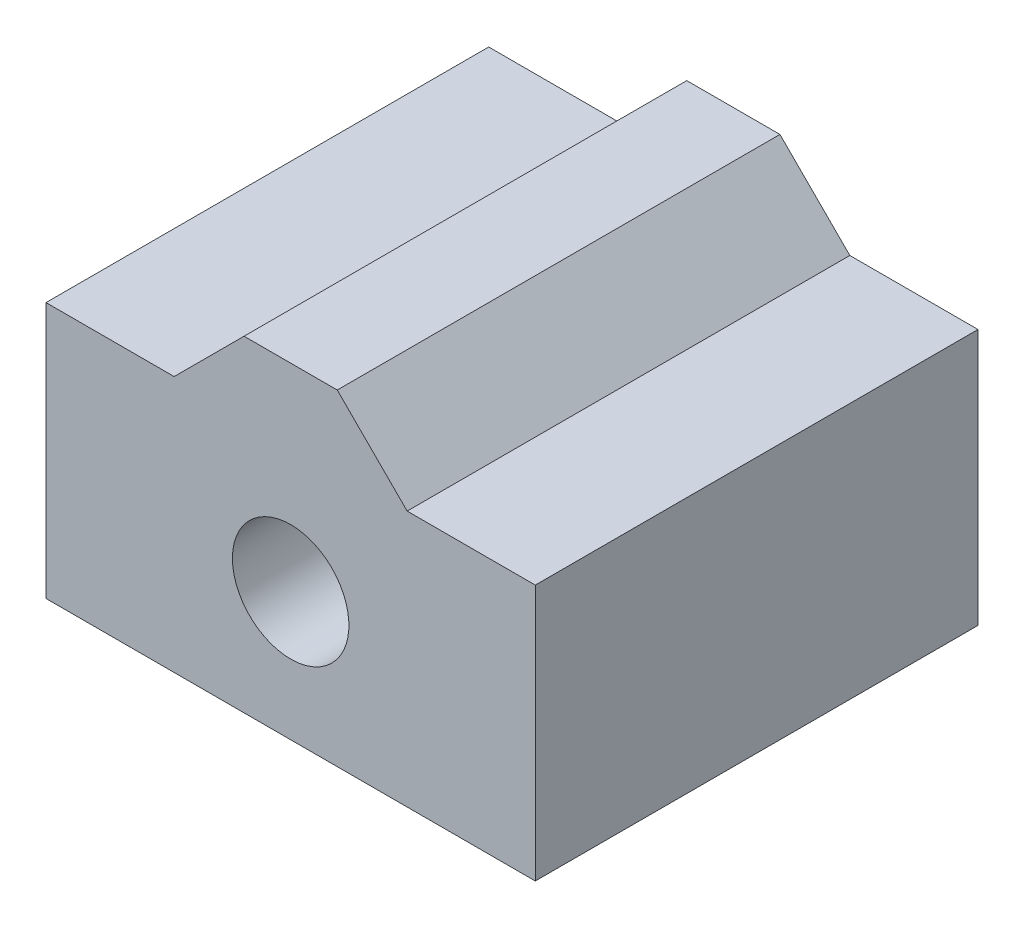
ISO-10303-21;
HEADER;
FILE_DESCRIPTION(('STEP AP214'),'2;1');
FILE_NAME('part.step','',(''),(''),'','','');
FILE_SCHEMA(('AUTOMOTIVE_DESIGN { 1 0 10303 214 1 1 1 1 }'));
ENDSEC;
DATA;
#1=APPLICATION_CONTEXT('core data for automotive mechanical design processes');
#2=APPLICATION_PROTOCOL_DEFINITION('international standard','automotive_design',2000,#1);
#3=PRODUCT_CONTEXT('',#1,'mechanical');
#4=PRODUCT('Part','Part','',(#3));
#5=PRODUCT_RELATED_PRODUCT_CATEGORY('part','',(#4));
#6=PRODUCT_DEFINITION_FORMATION('','',#4);
#7=PRODUCT_DEFINITION_CONTEXT('part definition',#1,'design');
#8=PRODUCT_DEFINITION('design','',#6,#7);
#9=PRODUCT_DEFINITION_SHAPE('','',#8);
#10=(LENGTH_UNIT() NAMED_UNIT(*) SI_UNIT(.MILLI.,.METRE.));
#11=(NAMED_UNIT(*) PLANE_ANGLE_UNIT() SI_UNIT($,.RADIAN.));
#12=(NAMED_UNIT(*) SI_UNIT($,.STERADIAN.) SOLID_ANGLE_UNIT());
#13=UNCERTAINTY_MEASURE_WITH_UNIT(LENGTH_MEASURE(1.E-05),#10,'distance_accuracy_value','');
#14=(GEOMETRIC_REPRESENTATION_CONTEXT(3) GLOBAL_UNCERTAINTY_ASSIGNED_CONTEXT((#13)) GLOBAL_UNIT_ASSIGNED_CONTEXT((#10,
#11,#12)) REPRESENTATION_CONTEXT('',''));
#15=CARTESIAN_POINT('',(0.,0.,0.));
#16=DIRECTION('',(0.,0.,1.));
#17=DIRECTION('',(1.,0.,0.));
#18=AXIS2_PLACEMENT_3D('',#15,#16,#17);
#19=CARTESIAN_POINT('',(8.334375,8.33437499999998,30.1625));
#20=DIRECTION('',(0.707106781186549,0.707106781186547,0.));
#21=DIRECTION('',(-0.707106781186547,0.707106781186549,0.));
#22=AXIS2_PLACEMENT_3D('',#19,#20,#21);
#23=PLANE('',#22);
#24=DIRECTION('',(0.707106781186546,-0.707106781186549,0.));
#25=VECTOR('',#24,1.);
#26=CARTESIAN_POINT('',(8.334375,8.33437499999998,0.));
#27=LINE('',#26,#25);
#28=CARTESIAN_POINT('',(3.175,13.49375,0.));
#29=VERTEX_POINT('',#28);
#30=CARTESIAN_POINT('',(7.93749999999998,8.73125,0.));
#31=VERTEX_POINT('',#30);
#32=EDGE_CURVE('E133',#29,#31,#27,.T.);
#33=ORIENTED_EDGE('',*,*,#32,.F.);
#34=DIRECTION('',(0.,0.,-1.));
#35=VECTOR('',#34,1.);
#36=CARTESIAN_POINT('',(3.175,13.49375,30.1625));
#37=LINE('',#36,#35);
#38=CARTESIAN_POINT('',(3.175,13.49375,30.1625));
#39=VERTEX_POINT('',#38);
#40=EDGE_CURVE('E11',#39,#29,#37,.T.);
#41=ORIENTED_EDGE('',*,*,#40,.F.);
#42=DIRECTION('',(0.707106781186546,-0.707106781186549,0.));
#43=VECTOR('',#42,1.);
#44=CARTESIAN_POINT('',(8.334375,8.33437499999998,30.1625));
#45=LINE('',#44,#43);
#46=CARTESIAN_POINT('',(7.93749999999998,8.73125,30.1625));
#47=VERTEX_POINT('',#46);
#48=EDGE_CURVE('E154',#39,#47,#45,.T.);
#49=ORIENTED_EDGE('',*,*,#48,.T.);
#50=DIRECTION('',(0.,0.,-1.));
#51=VECTOR('',#50,1.);
#52=CARTESIAN_POINT('',(7.93749999999998,8.73125,30.1625));
#53=LINE('',#52,#51);
#54=EDGE_CURVE('E51',#47,#31,#53,.T.);
#55=ORIENTED_EDGE('',*,*,#54,.T.);
#56=EDGE_LOOP('',(#33,#41,#49,#55));
#57=FACE_BOUND('',#56,.T.);
#58=ADVANCED_FACE('F35',(#57),#23,.T.);
#59=CARTESIAN_POINT('',(0.,13.49375,30.1625));
#60=DIRECTION('',(0.,1.,0.));
#61=DIRECTION('',(0.,0.,1.));
#62=AXIS2_PLACEMENT_3D('',#59,#60,#61);
#63=PLANE('',#62);
#64=DIRECTION('',(1.,0.,0.));
#65=VECTOR('',#64,1.);
#66=CARTESIAN_POINT('',(0.,13.49375,0.));
#67=LINE('',#66,#65);
#68=CARTESIAN_POINT('',(-3.175,13.49375,0.));
#69=VERTEX_POINT('',#68);
#70=EDGE_CURVE('E135',#69,#29,#67,.T.);
#71=ORIENTED_EDGE('',*,*,#70,.F.);
#72=DIRECTION('',(0.,0.,-1.));
#73=VECTOR('',#72,1.);
#74=CARTESIAN_POINT('',(-3.175,13.49375,30.1625));
#75=LINE('',#74,#73);
#76=CARTESIAN_POINT('',(-3.175,13.49375,30.1625));
#77=VERTEX_POINT('',#76);
#78=EDGE_CURVE('E43',#77,#69,#75,.T.);
#79=ORIENTED_EDGE('',*,*,#78,.F.);
#80=DIRECTION('',(1.,0.,0.));
#81=VECTOR('',#80,1.);
#82=CARTESIAN_POINT('',(0.,13.49375,30.1625));
#83=LINE('',#82,#81);
#84=EDGE_CURVE('E176',#77,#39,#83,.T.);
#85=ORIENTED_EDGE('',*,*,#84,.T.);
#86=ORIENTED_EDGE('',*,*,#40,.T.);
#87=EDGE_LOOP('',(#71,#79,#85,#86));
#88=FACE_BOUND('',#87,.T.);
#89=ADVANCED_FACE('F175',(#88),#63,.T.);
#90=CARTESIAN_POINT('',(-8.33437499999999,8.33437500000002,30.1625));
#91=DIRECTION('',(0.707106781186546,-0.707106781186549,0.));
#92=DIRECTION('',(0.707106781186549,0.707106781186546,0.));
#93=AXIS2_PLACEMENT_3D('',#90,#91,#92);
#94=PLANE('',#93);
#95=DIRECTION('',(-0.707106781186549,-0.707106781186546,0.));
#96=VECTOR('',#95,1.);
#97=CARTESIAN_POINT('',(-8.33437499999999,8.33437500000002,0.));
#98=LINE('',#97,#96);
#99=CARTESIAN_POINT('',(-7.93750000000001,8.73125,0.));
#100=VERTEX_POINT('',#99);
#101=EDGE_CURVE('E138',#69,#100,#98,.T.);
#102=ORIENTED_EDGE('',*,*,#101,.T.);
#103=DIRECTION('',(0.,0.,-1.));
#104=VECTOR('',#103,1.);
#105=CARTESIAN_POINT('',(-7.93750000000001,8.73125,30.1625));
#106=LINE('',#105,#104);
#107=CARTESIAN_POINT('',(-7.93750000000001,8.73125,30.1625));
#108=VERTEX_POINT('',#107);
#109=EDGE_CURVE('E160',#108,#100,#106,.T.);
#110=ORIENTED_EDGE('',*,*,#109,.F.);
#111=DIRECTION('',(-0.707106781186549,-0.707106781186546,0.));
#112=VECTOR('',#111,1.);
#113=CARTESIAN_POINT('',(-8.33437499999999,8.33437500000002,30.1625));
#114=LINE('',#113,#112);
#115=EDGE_CURVE('E166',#77,#108,#114,.T.);
#116=ORIENTED_EDGE('',*,*,#115,.F.);
#117=ORIENTED_EDGE('',*,*,#78,.T.);
#118=EDGE_LOOP('',(#102,#110,#116,#117));
#119=FACE_BOUND('',#118,.T.);
#120=ADVANCED_FACE('F164',(#119),#94,.F.);
#121=CARTESIAN_POINT('',(0.,8.73125,30.1625));
#122=DIRECTION('',(0.,1.,0.));
#123=DIRECTION('',(0.,0.,1.));
#124=AXIS2_PLACEMENT_3D('',#121,#122,#123);
#125=PLANE('',#124);
#126=DIRECTION('',(1.,0.,0.));
#127=VECTOR('',#126,1.);
#128=CARTESIAN_POINT('',(0.,8.73125,0.));
#129=LINE('',#128,#127);
#130=CARTESIAN_POINT('',(-16.66875,8.73125,0.));
#131=VERTEX_POINT('',#130);
#132=EDGE_CURVE('E141',#131,#100,#129,.T.);
#133=ORIENTED_EDGE('',*,*,#132,.F.);
#134=DIRECTION('',(0.,0.,-1.));
#135=VECTOR('',#134,1.);
#136=CARTESIAN_POINT('',(-16.66875,8.73125,30.1625));
#137=LINE('',#136,#135);
#138=CARTESIAN_POINT('',(-16.66875,8.73125,30.1625));
#139=VERTEX_POINT('',#138);
#140=EDGE_CURVE('E158',#139,#131,#137,.T.);
#141=ORIENTED_EDGE('',*,*,#140,.F.);
#142=DIRECTION('',(1.,0.,0.));
#143=VECTOR('',#142,1.);
#144=CARTESIAN_POINT('',(0.,8.73125,30.1625));
#145=LINE('',#144,#143);
#146=EDGE_CURVE('E128',#139,#108,#145,.T.);
#147=ORIENTED_EDGE('',*,*,#146,.T.);
#148=ORIENTED_EDGE('',*,*,#109,.T.);
#149=EDGE_LOOP('',(#133,#141,#147,#148));
#150=FACE_BOUND('',#149,.T.);
#151=ADVANCED_FACE('F182',(#150),#125,.T.);
#152=CARTESIAN_POINT('',(-16.66875,0.,30.1625));
#153=DIRECTION('',(-1.,0.,0.));
#154=DIRECTION('',(0.,0.,1.));
#155=AXIS2_PLACEMENT_3D('',#152,#153,#154);
#156=PLANE('',#155);
#157=DIRECTION('',(0.,1.,0.));
#158=VECTOR('',#157,1.);
#159=CARTESIAN_POINT('',(-16.66875,0.,0.));
#160=LINE('',#159,#158);
#161=CARTESIAN_POINT('',(-16.66875,-8.73125,0.));
#162=VERTEX_POINT('',#161);
#163=EDGE_CURVE('E144',#162,#131,#160,.T.);
#164=ORIENTED_EDGE('',*,*,#163,.F.);
#165=DIRECTION('',(0.,0.,-1.));
#166=VECTOR('',#165,1.);
#167=CARTESIAN_POINT('',(-16.66875,-8.73125,30.1625));
#168=LINE('',#167,#166);
#169=CARTESIAN_POINT('',(-16.66875,-8.73125,30.1625));
#170=VERTEX_POINT('',#169);
#171=EDGE_CURVE('E121',#170,#162,#168,.T.);
#172=ORIENTED_EDGE('',*,*,#171,.F.);
#173=DIRECTION('',(0.,1.,0.));
#174=VECTOR('',#173,1.);
#175=CARTESIAN_POINT('',(-16.66875,0.,30.1625));
#176=LINE('',#175,#174);
#177=EDGE_CURVE('E111',#170,#139,#176,.T.);
#178=ORIENTED_EDGE('',*,*,#177,.T.);
#179=ORIENTED_EDGE('',*,*,#140,.T.);
#180=EDGE_LOOP('',(#164,#172,#178,#179));
#181=FACE_BOUND('',#180,.T.);
#182=ADVANCED_FACE('F191',(#181),#156,.T.);
#183=CARTESIAN_POINT('',(0.,-8.73125,30.1625));
#184=DIRECTION('',(0.,1.,0.));
#185=DIRECTION('',(0.,0.,1.));
#186=AXIS2_PLACEMENT_3D('',#183,#184,#185);
#187=PLANE('',#186);
#188=DIRECTION('',(1.,0.,0.));
#189=VECTOR('',#188,1.);
#190=CARTESIAN_POINT('',(0.,-8.73125,0.));
#191=LINE('',#190,#189);
#192=CARTESIAN_POINT('',(16.66875,-8.73125,0.));
#193=VERTEX_POINT('',#192);
#194=EDGE_CURVE('E118',#162,#193,#191,.T.);
#195=ORIENTED_EDGE('',*,*,#194,.T.);
#196=DIRECTION('',(0.,0.,-1.));
#197=VECTOR('',#196,1.);
#198=CARTESIAN_POINT('',(16.66875,-8.73125,30.1625));
#199=LINE('',#198,#197);
#200=CARTESIAN_POINT('',(16.66875,-8.73125,30.1625));
#201=VERTEX_POINT('',#200);
#202=EDGE_CURVE('E115',#201,#193,#199,.T.);
#203=ORIENTED_EDGE('',*,*,#202,.F.);
#204=DIRECTION('',(1.,0.,0.));
#205=VECTOR('',#204,1.);
#206=CARTESIAN_POINT('',(0.,-8.73125,30.1625));
#207=LINE('',#206,#205);
#208=EDGE_CURVE('E102',#170,#201,#207,.T.);
#209=ORIENTED_EDGE('',*,*,#208,.F.);
#210=ORIENTED_EDGE('',*,*,#171,.T.);
#211=EDGE_LOOP('',(#195,#203,#209,#210));
#212=FACE_BOUND('',#211,.T.);
#213=ADVANCED_FACE('F116',(#212),#187,.F.);
#214=CARTESIAN_POINT('',(16.66875,0.,30.1625));
#215=DIRECTION('',(-1.,0.,0.));
#216=DIRECTION('',(0.,0.,1.));
#217=AXIS2_PLACEMENT_3D('',#214,#215,#216);
#218=PLANE('',#217);
#219=DIRECTION('',(0.,1.,0.));
#220=VECTOR('',#219,1.);
#221=CARTESIAN_POINT('',(16.66875,0.,0.));
#222=LINE('',#221,#220);
#223=CARTESIAN_POINT('',(16.66875,8.73125,0.));
#224=VERTEX_POINT('',#223);
#225=EDGE_CURVE('E149',#193,#224,#222,.T.);
#226=ORIENTED_EDGE('',*,*,#225,.T.);
#227=DIRECTION('',(0.,0.,-1.));
#228=VECTOR('',#227,1.);
#229=CARTESIAN_POINT('',(16.66875,8.73125,30.1625));
#230=LINE('',#229,#228);
#231=CARTESIAN_POINT('',(16.66875,8.73125,30.1625));
#232=VERTEX_POINT('',#231);
#233=EDGE_CURVE('E77',#232,#224,#230,.T.);
#234=ORIENTED_EDGE('',*,*,#233,.F.);
#235=DIRECTION('',(0.,1.,0.));
#236=VECTOR('',#235,1.);
#237=CARTESIAN_POINT('',(16.66875,0.,30.1625));
#238=LINE('',#237,#236);
#239=EDGE_CURVE('E108',#201,#232,#238,.T.);
#240=ORIENTED_EDGE('',*,*,#239,.F.);
#241=ORIENTED_EDGE('',*,*,#202,.T.);
#242=EDGE_LOOP('',(#226,#234,#240,#241));
#243=FACE_BOUND('',#242,.T.);
#244=ADVANCED_FACE('F123',(#243),#218,.F.);
#245=EDGE_CURVE('E145',#31,#224,#129,.T.);
#246=ORIENTED_EDGE('',*,*,#245,.F.);
#247=ORIENTED_EDGE('',*,*,#54,.F.);
#248=EDGE_CURVE('E124',#47,#232,#145,.T.);
#249=ORIENTED_EDGE('',*,*,#248,.T.);
#250=ORIENTED_EDGE('',*,*,#233,.T.);
#251=EDGE_LOOP('',(#246,#247,#249,#250));
#252=FACE_BOUND('',#251,.T.);
#253=ADVANCED_FACE('F178',(#252),#125,.T.);
#254=CARTESIAN_POINT('',(0.,0.,30.1625));
#255=DIRECTION('',(0.,0.,-1.));
#256=DIRECTION('',(-1.,0.,0.));
#257=AXIS2_PLACEMENT_3D('',#254,#255,#256);
#258=CYLINDRICAL_SURFACE('',#257,3.96875);
#259=CARTESIAN_POINT('',(0.,0.,30.1625));
#260=DIRECTION('',(0.,0.,1.));
#261=DIRECTION('',(1.,0.,0.));
#262=AXIS2_PLACEMENT_3D('',#259,#260,#261);
#263=CIRCLE('',#262,3.96875);
#264=CARTESIAN_POINT('',(-3.96874999999999,0.,30.1625));
#265=VERTEX_POINT('',#264);
#266=EDGE_CURVE('E126',#265,#265,#263,.T.);
#267=CARTESIAN_POINT('',(0.,0.,0.));
#268=DIRECTION('',(0.,0.,1.));
#269=DIRECTION('',(1.,0.,0.));
#270=AXIS2_PLACEMENT_3D('',#267,#268,#269);
#271=CIRCLE('',#270,3.96875);
#272=CARTESIAN_POINT('',(-3.96874999999999,0.,0.));
#273=VERTEX_POINT('',#272);
#274=EDGE_CURVE('E151',#273,#273,#271,.T.);
#275=CARTESIAN_POINT('',(-3.96874999999999,0.,30.1625));
#276=CARTESIAN_POINT('',(-3.96874999999999,0.,29.8483072916667));
#277=CARTESIAN_POINT('',(-3.96874999999999,0.,29.5341145833333));
#278=CARTESIAN_POINT('',(-3.96874999999999,0.,28.9057291666667));
#279=CARTESIAN_POINT('',(-3.96874999999999,0.,28.5915364583333));
#280=CARTESIAN_POINT('',(-3.96874999999999,0.,27.9631510416667));
#281=CARTESIAN_POINT('',(-3.96874999999999,0.,27.6489583333333));
#282=CARTESIAN_POINT('',(-3.96874999999999,0.,27.0205729166667));
#283=CARTESIAN_POINT('',(-3.96874999999999,0.,26.7063802083333));
#284=CARTESIAN_POINT('',(-3.96874999999999,0.,26.0779947916667));
#285=CARTESIAN_POINT('',(-3.96874999999999,0.,25.7638020833333));
#286=CARTESIAN_POINT('',(-3.96874999999999,0.,25.1354166666667));
#287=CARTESIAN_POINT('',(-3.96874999999999,0.,24.8212239583333));
#288=CARTESIAN_POINT('',(-3.96874999999999,0.,24.1928385416667));
#289=CARTESIAN_POINT('',(-3.96874999999999,0.,23.8786458333333));
#290=CARTESIAN_POINT('',(-3.96874999999999,0.,23.2502604166667));
#291=CARTESIAN_POINT('',(-3.96874999999999,0.,22.9360677083333));
#292=CARTESIAN_POINT('',(-3.96874999999999,0.,22.3076822916667));
#293=CARTESIAN_POINT('',(-3.96874999999999,0.,21.9934895833333));
#294=CARTESIAN_POINT('',(-3.96874999999999,0.,21.3651041666667));
#295=CARTESIAN_POINT('',(-3.96874999999999,0.,21.0509114583333));
#296=CARTESIAN_POINT('',(-3.96874999999999,0.,20.4225260416667));
#297=CARTESIAN_POINT('',(-3.96874999999999,0.,20.1083333333333));
#298=CARTESIAN_POINT('',(-3.96874999999999,0.,19.4799479166667));
#299=CARTESIAN_POINT('',(-3.96874999999999,0.,19.1657552083333));
#300=CARTESIAN_POINT('',(-3.96874999999999,0.,18.5373697916667));
#301=CARTESIAN_POINT('',(-3.96874999999999,0.,18.2231770833333));
#302=CARTESIAN_POINT('',(-3.96874999999999,0.,17.5947916666667));
#303=CARTESIAN_POINT('',(-3.96874999999999,0.,17.2805989583333));
#304=CARTESIAN_POINT('',(-3.96874999999999,0.,16.6522135416667));
#305=CARTESIAN_POINT('',(-3.96874999999999,0.,16.3380208333333));
#306=CARTESIAN_POINT('',(-3.96874999999999,0.,15.7096354166667));
#307=CARTESIAN_POINT('',(-3.96874999999999,0.,15.3954427083333));
#308=CARTESIAN_POINT('',(-3.96874999999999,0.,14.7670572916667));
#309=CARTESIAN_POINT('',(-3.96874999999999,0.,14.4528645833333));
#310=CARTESIAN_POINT('',(-3.96874999999999,0.,13.8244791666667));
#311=CARTESIAN_POINT('',(-3.96874999999999,0.,13.5102864583333));
#312=CARTESIAN_POINT('',(-3.96874999999999,0.,12.8819010416667));
#313=CARTESIAN_POINT('',(-3.96874999999999,0.,12.5677083333333));
#314=CARTESIAN_POINT('',(-3.96874999999999,0.,11.9393229166667));
#315=CARTESIAN_POINT('',(-3.96874999999999,0.,11.6251302083333));
#316=CARTESIAN_POINT('',(-3.96874999999999,0.,10.9967447916667));
#317=CARTESIAN_POINT('',(-3.96874999999999,0.,10.6825520833333));
#318=CARTESIAN_POINT('',(-3.96874999999999,0.,10.0541666666667));
#319=CARTESIAN_POINT('',(-3.96874999999999,0.,9.73997395833333));
#320=CARTESIAN_POINT('',(-3.96874999999999,0.,9.11158854166667));
#321=CARTESIAN_POINT('',(-3.96874999999999,0.,8.79739583333333));
#322=CARTESIAN_POINT('',(-3.96874999999999,0.,8.16901041666667));
#323=CARTESIAN_POINT('',(-3.96874999999999,0.,7.85481770833333));
#324=CARTESIAN_POINT('',(-3.96874999999999,0.,7.22643229166667));
#325=CARTESIAN_POINT('',(-3.96874999999999,0.,6.91223958333333));
#326=CARTESIAN_POINT('',(-3.96874999999999,0.,6.28385416666667));
#327=CARTESIAN_POINT('',(-3.96874999999999,0.,5.96966145833333));
#328=CARTESIAN_POINT('',(-3.96874999999999,0.,5.34127604166667));
#329=CARTESIAN_POINT('',(-3.96874999999999,0.,5.02708333333333));
#330=CARTESIAN_POINT('',(-3.96874999999999,0.,4.39869791666667));
#331=CARTESIAN_POINT('',(-3.96874999999999,0.,4.08450520833333));
#332=CARTESIAN_POINT('',(-3.96874999999999,0.,3.45611979166667));
#333=CARTESIAN_POINT('',(-3.96874999999999,0.,3.14192708333333));
#334=CARTESIAN_POINT('',(-3.96874999999999,0.,2.51354166666667));
#335=CARTESIAN_POINT('',(-3.96874999999999,0.,2.19934895833333));
#336=CARTESIAN_POINT('',(-3.96874999999999,0.,1.57096354166667));
#337=CARTESIAN_POINT('',(-3.96874999999999,0.,1.25677083333333));
#338=CARTESIAN_POINT('',(-3.96874999999999,0.,0.628385416666666));
#339=CARTESIAN_POINT('',(-3.96874999999999,0.,0.314192708333333));
#340=CARTESIAN_POINT('',(-3.96874999999999,0.,0.));
#341=B_SPLINE_CURVE_WITH_KNOTS('',3,(#275,#276,#277,#278,#279,#280,#281,#282,#283,#284,#285,
#286,#287,#288,#289,#290,#291,#292,#293,#294,#295,#296,#297,#298,#299,#300,#301,#302,#303,#304,
#305,#306,#307,#308,#309,#310,#311,#312,#313,#314,#315,#316,#317,#318,#319,#320,#321,#322,#323,
#324,#325,#326,#327,#328,#329,#330,#331,#332,#333,#334,#335,#336,#337,#338,#339,#340),
.UNSPECIFIED.,.F.,.F.,(4,2,2,2,2,2,2,2,2,2,2,2,2,2,2,2,2,2,2,2,2,2,2,2,2,2,2,2,2,2,2,2,4),(0.,
0.942578125000003,1.88515625,2.827734375,3.7703125,4.712890625,5.65546875,6.598046875,7.540625,
8.483203125,9.42578125,10.368359375,11.3109375,12.253515625,13.19609375,14.138671875,15.08125,
16.023828125,16.96640625,17.908984375,18.8515625,19.794140625,20.73671875,21.679296875,
22.621875,23.564453125,24.50703125,25.449609375,26.3921875,27.334765625,28.27734375,
29.219921875,30.1625),.UNSPECIFIED.);
#342=EDGE_CURVE('BSEAM180',#265,#273,#341,.T.);
#343=ORIENTED_EDGE('',*,*,#266,.T.);
#344=ORIENTED_EDGE('',*,*,#274,.F.);
#345=ORIENTED_EDGE('',*,*,#342,.T.);
#346=ORIENTED_EDGE('',*,*,#342,.F.);
#347=EDGE_LOOP('',(#343,#345,#344,#346));
#348=FACE_BOUND('',#347,.T.);
#349=ADVANCED_FACE('F180',(#348),#258,.F.);
#350=CARTESIAN_POINT('',(0.,0.,30.1625));
#351=DIRECTION('',(0.,0.,1.));
#352=DIRECTION('',(1.,0.,0.));
#353=AXIS2_PLACEMENT_3D('',#350,#351,#352);
#354=PLANE('',#353);
#355=ORIENTED_EDGE('',*,*,#48,.F.);
#356=ORIENTED_EDGE('',*,*,#84,.F.);
#357=ORIENTED_EDGE('',*,*,#115,.T.);
#358=ORIENTED_EDGE('',*,*,#146,.F.);
#359=ORIENTED_EDGE('',*,*,#177,.F.);
#360=ORIENTED_EDGE('',*,*,#208,.T.);
#361=ORIENTED_EDGE('',*,*,#239,.T.);
#362=ORIENTED_EDGE('',*,*,#248,.F.);
#363=EDGE_LOOP('',(#355,#356,#357,#358,#359,#360,#361,#362));
#364=FACE_BOUND('',#363,.T.);
#365=ORIENTED_EDGE('',*,*,#266,.F.);
#366=EDGE_LOOP('',(#365));
#367=FACE_BOUND('',#366,.T.);
#368=ADVANCED_FACE('F104',(#364,#367),#354,.T.);
#369=CARTESIAN_POINT('',(0.,0.,0.));
#370=DIRECTION('',(0.,0.,1.));
#371=DIRECTION('',(1.,0.,0.));
#372=AXIS2_PLACEMENT_3D('',#369,#370,#371);
#373=PLANE('',#372);
#374=ORIENTED_EDGE('',*,*,#32,.T.);
#375=ORIENTED_EDGE('',*,*,#245,.T.);
#376=ORIENTED_EDGE('',*,*,#225,.F.);
#377=ORIENTED_EDGE('',*,*,#194,.F.);
#378=ORIENTED_EDGE('',*,*,#163,.T.);
#379=ORIENTED_EDGE('',*,*,#132,.T.);
#380=ORIENTED_EDGE('',*,*,#101,.F.);
#381=ORIENTED_EDGE('',*,*,#70,.T.);
#382=EDGE_LOOP('',(#374,#375,#376,#377,#378,#379,#380,#381));
#383=FACE_BOUND('',#382,.T.);
#384=ORIENTED_EDGE('',*,*,#274,.T.);
#385=EDGE_LOOP('',(#384));
#386=FACE_BOUND('',#385,.T.);
#387=ADVANCED_FACE('F172',(#383,#386),#373,.F.);
#388=CLOSED_SHELL('',(#58,#89,#120,#151,#182,#213,#244,#253,#349,#368,#387));
#389=MANIFOLD_SOLID_BREP('B2',#388);
#390=ADVANCED_BREP_SHAPE_REPRESENTATION('',(#18,#389),#14);
#391=SHAPE_DEFINITION_REPRESENTATION(#9,#390);
ENDSEC;
END-ISO-10303-21;
